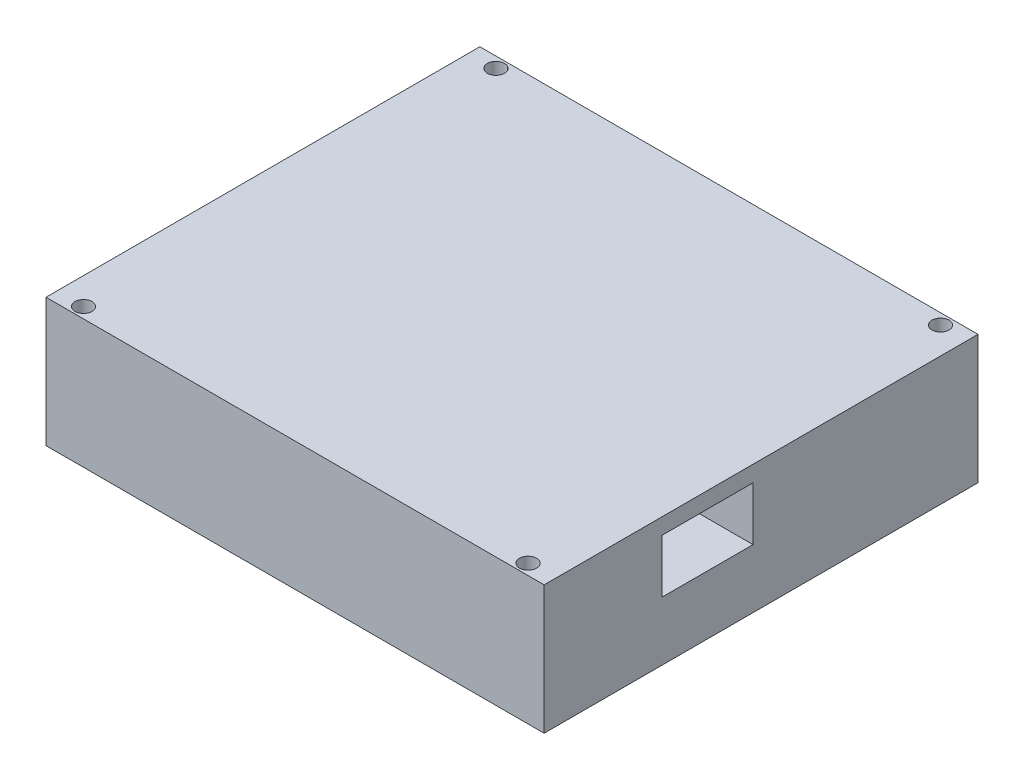
ISO-10303-21;
HEADER;
FILE_DESCRIPTION(('STEP AP214'),'2;1');
FILE_NAME('part.step','',(''),(''),'','','');
FILE_SCHEMA(('AUTOMOTIVE_DESIGN { 1 0 10303 214 1 1 1 1 }'));
ENDSEC;
DATA;
#1=APPLICATION_CONTEXT('core data for automotive mechanical design processes');
#2=APPLICATION_PROTOCOL_DEFINITION('international standard','automotive_design',2000,#1);
#3=PRODUCT_CONTEXT('',#1,'mechanical');
#4=PRODUCT('Part','Part','',(#3));
#5=PRODUCT_RELATED_PRODUCT_CATEGORY('part','',(#4));
#6=PRODUCT_DEFINITION_FORMATION('','',#4);
#7=PRODUCT_DEFINITION_CONTEXT('part definition',#1,'design');
#8=PRODUCT_DEFINITION('design','',#6,#7);
#9=PRODUCT_DEFINITION_SHAPE('','',#8);
#10=(LENGTH_UNIT() NAMED_UNIT(*) SI_UNIT(.MILLI.,.METRE.));
#11=(NAMED_UNIT(*) PLANE_ANGLE_UNIT() SI_UNIT($,.RADIAN.));
#12=(NAMED_UNIT(*) SI_UNIT($,.STERADIAN.) SOLID_ANGLE_UNIT());
#13=UNCERTAINTY_MEASURE_WITH_UNIT(LENGTH_MEASURE(1.E-05),#10,'distance_accuracy_value','');
#14=(GEOMETRIC_REPRESENTATION_CONTEXT(3) GLOBAL_UNCERTAINTY_ASSIGNED_CONTEXT((#13)) GLOBAL_UNIT_ASSIGNED_CONTEXT((#10,
#11,#12)) REPRESENTATION_CONTEXT('',''));
#15=CARTESIAN_POINT('',(0.,0.,0.));
#16=DIRECTION('',(0.,0.,1.));
#17=DIRECTION('',(1.,0.,0.));
#18=AXIS2_PLACEMENT_3D('',#15,#16,#17);
#19=CARTESIAN_POINT('',(46.5,24.,-40.5));
#20=DIRECTION('',(-1.,0.,0.));
#21=DIRECTION('',(0.,0.,1.));
#22=AXIS2_PLACEMENT_3D('',#19,#20,#21);
#23=PLANE('',#22);
#24=DIRECTION('',(0.,0.,1.));
#25=VECTOR('',#24,1.);
#26=CARTESIAN_POINT('',(46.5,21.,18.5));
#27=LINE('',#26,#25);
#28=CARTESIAN_POINT('',(46.5,21.,1.5));
#29=VERTEX_POINT('',#28);
#30=CARTESIAN_POINT('',(46.5,21.,18.5));
#31=VERTEX_POINT('',#30);
#32=EDGE_CURVE('E148',#29,#31,#27,.T.);
#33=ORIENTED_EDGE('',*,*,#32,.F.);
#34=DIRECTION('',(0.,1.,0.));
#35=VECTOR('',#34,1.);
#36=CARTESIAN_POINT('',(46.5,21.,1.5));
#37=LINE('',#36,#35);
#38=CARTESIAN_POINT('',(46.5,11.,1.5));
#39=VERTEX_POINT('',#38);
#40=EDGE_CURVE('E53',#39,#29,#37,.T.);
#41=ORIENTED_EDGE('',*,*,#40,.F.);
#42=DIRECTION('',(0.,0.,-1.));
#43=VECTOR('',#42,1.);
#44=CARTESIAN_POINT('',(46.5,11.,18.5));
#45=LINE('',#44,#43);
#46=CARTESIAN_POINT('',(46.5,11.,18.5));
#47=VERTEX_POINT('',#46);
#48=EDGE_CURVE('E135',#47,#39,#45,.T.);
#49=ORIENTED_EDGE('',*,*,#48,.F.);
#50=DIRECTION('',(0.,-1.,0.));
#51=VECTOR('',#50,1.);
#52=CARTESIAN_POINT('',(46.5,21.,18.5));
#53=LINE('',#52,#51);
#54=EDGE_CURVE('E139',#31,#47,#53,.T.);
#55=ORIENTED_EDGE('',*,*,#54,.F.);
#56=EDGE_LOOP('',(#33,#41,#49,#55));
#57=FACE_BOUND('',#56,.T.);
#58=DIRECTION('',(0.,0.,-1.));
#59=VECTOR('',#58,1.);
#60=CARTESIAN_POINT('',(46.5,0.,-40.5));
#61=LINE('',#60,#59);
#62=CARTESIAN_POINT('',(46.5,0.,40.5));
#63=VERTEX_POINT('',#62);
#64=CARTESIAN_POINT('',(46.5,0.,-40.5));
#65=VERTEX_POINT('',#64);
#66=EDGE_CURVE('E191',#63,#65,#61,.T.);
#67=ORIENTED_EDGE('',*,*,#66,.T.);
#68=DIRECTION('',(0.,-1.,0.));
#69=VECTOR('',#68,1.);
#70=CARTESIAN_POINT('',(46.5,24.,-40.5));
#71=LINE('',#70,#69);
#72=CARTESIAN_POINT('',(46.5,24.,-40.5));
#73=VERTEX_POINT('',#72);
#74=EDGE_CURVE('E11',#73,#65,#71,.T.);
#75=ORIENTED_EDGE('',*,*,#74,.F.);
#76=DIRECTION('',(0.,0.,-1.));
#77=VECTOR('',#76,1.);
#78=CARTESIAN_POINT('',(46.5,24.,-40.5));
#79=LINE('',#78,#77);
#80=CARTESIAN_POINT('',(46.5,24.,40.5));
#81=VERTEX_POINT('',#80);
#82=EDGE_CURVE('E195',#81,#73,#79,.T.);
#83=ORIENTED_EDGE('',*,*,#82,.F.);
#84=DIRECTION('',(0.,-1.,0.));
#85=VECTOR('',#84,1.);
#86=CARTESIAN_POINT('',(46.5,24.,40.5));
#87=LINE('',#86,#85);
#88=EDGE_CURVE('E205',#81,#63,#87,.T.);
#89=ORIENTED_EDGE('',*,*,#88,.T.);
#90=EDGE_LOOP('',(#67,#75,#83,#89));
#91=FACE_BOUND('',#90,.T.);
#92=ADVANCED_FACE('F38',(#57,#91),#23,.F.);
#93=CARTESIAN_POINT('',(-46.5,24.,-40.5));
#94=DIRECTION('',(0.,0.,1.));
#95=DIRECTION('',(1.,0.,0.));
#96=AXIS2_PLACEMENT_3D('',#93,#94,#95);
#97=PLANE('',#96);
#98=DIRECTION('',(-1.,0.,0.));
#99=VECTOR('',#98,1.);
#100=CARTESIAN_POINT('',(-46.5,0.,-40.5));
#101=LINE('',#100,#99);
#102=CARTESIAN_POINT('',(-46.5,0.,-40.5));
#103=VERTEX_POINT('',#102);
#104=EDGE_CURVE('E209',#65,#103,#101,.T.);
#105=ORIENTED_EDGE('',*,*,#104,.T.);
#106=DIRECTION('',(0.,-1.,0.));
#107=VECTOR('',#106,1.);
#108=CARTESIAN_POINT('',(-46.5,24.,-40.5));
#109=LINE('',#108,#107);
#110=CARTESIAN_POINT('',(-46.5,24.,-40.5));
#111=VERTEX_POINT('',#110);
#112=EDGE_CURVE('E46',#111,#103,#109,.T.);
#113=ORIENTED_EDGE('',*,*,#112,.F.);
#114=DIRECTION('',(-1.,0.,0.));
#115=VECTOR('',#114,1.);
#116=CARTESIAN_POINT('',(-46.5,24.,-40.5));
#117=LINE('',#116,#115);
#118=EDGE_CURVE('E90',#73,#111,#117,.T.);
#119=ORIENTED_EDGE('',*,*,#118,.F.);
#120=ORIENTED_EDGE('',*,*,#74,.T.);
#121=EDGE_LOOP('',(#105,#113,#119,#120));
#122=FACE_BOUND('',#121,.T.);
#123=ADVANCED_FACE('F244',(#122),#97,.F.);
#124=CARTESIAN_POINT('',(-46.5,24.,-40.5));
#125=DIRECTION('',(1.,0.,0.));
#126=DIRECTION('',(0.,0.,-1.));
#127=AXIS2_PLACEMENT_3D('',#124,#125,#126);
#128=PLANE('',#127);
#129=DIRECTION('',(0.,0.,1.));
#130=VECTOR('',#129,1.);
#131=CARTESIAN_POINT('',(-46.5,0.,-40.5));
#132=LINE('',#131,#130);
#133=CARTESIAN_POINT('',(-46.5,0.,40.5));
#134=VERTEX_POINT('',#133);
#135=EDGE_CURVE('E212',#103,#134,#132,.T.);
#136=ORIENTED_EDGE('',*,*,#135,.T.);
#137=DIRECTION('',(0.,-1.,0.));
#138=VECTOR('',#137,1.);
#139=CARTESIAN_POINT('',(-46.5,24.,40.5));
#140=LINE('',#139,#138);
#141=CARTESIAN_POINT('',(-46.5,24.,40.5));
#142=VERTEX_POINT('',#141);
#143=EDGE_CURVE('E219',#142,#134,#140,.T.);
#144=ORIENTED_EDGE('',*,*,#143,.F.);
#145=DIRECTION('',(0.,0.,1.));
#146=VECTOR('',#145,1.);
#147=CARTESIAN_POINT('',(-46.5,24.,-40.5));
#148=LINE('',#147,#146);
#149=EDGE_CURVE('E200',#111,#142,#148,.T.);
#150=ORIENTED_EDGE('',*,*,#149,.F.);
#151=ORIENTED_EDGE('',*,*,#112,.T.);
#152=EDGE_LOOP('',(#136,#144,#150,#151));
#153=FACE_BOUND('',#152,.T.);
#154=ADVANCED_FACE('F226',(#153),#128,.F.);
#155=CARTESIAN_POINT('',(-46.5,24.,40.5));
#156=DIRECTION('',(0.,0.,-1.));
#157=DIRECTION('',(-1.,0.,0.));
#158=AXIS2_PLACEMENT_3D('',#155,#156,#157);
#159=PLANE('',#158);
#160=DIRECTION('',(1.,0.,0.));
#161=VECTOR('',#160,1.);
#162=CARTESIAN_POINT('',(-46.5,0.,40.5));
#163=LINE('',#162,#161);
#164=EDGE_CURVE('E83',#134,#63,#163,.T.);
#165=ORIENTED_EDGE('',*,*,#164,.T.);
#166=ORIENTED_EDGE('',*,*,#88,.F.);
#167=DIRECTION('',(1.,0.,0.));
#168=VECTOR('',#167,1.);
#169=CARTESIAN_POINT('',(-46.5,24.,40.5));
#170=LINE('',#169,#168);
#171=EDGE_CURVE('E62',#142,#81,#170,.T.);
#172=ORIENTED_EDGE('',*,*,#171,.F.);
#173=ORIENTED_EDGE('',*,*,#143,.T.);
#174=EDGE_LOOP('',(#165,#166,#172,#173));
#175=FACE_BOUND('',#174,.T.);
#176=ADVANCED_FACE('F234',(#175),#159,.F.);
#177=CARTESIAN_POINT('',(0.,24.,0.));
#178=DIRECTION('',(0.,1.,0.));
#179=DIRECTION('',(0.,0.,1.));
#180=AXIS2_PLACEMENT_3D('',#177,#178,#179);
#181=PLANE('',#180);
#182=CARTESIAN_POINT('',(41.5,24.,-38.5));
#183=DIRECTION('',(0.,1.,0.));
#184=DIRECTION('',(0.,0.,-1.));
#185=AXIS2_PLACEMENT_3D('',#182,#183,#184);
#186=CIRCLE('',#185,1.6);
#187=CARTESIAN_POINT('',(41.5,24.,-40.1));
#188=VERTEX_POINT('',#187);
#189=EDGE_CURVE('E157',#188,#188,#186,.T.);
#190=ORIENTED_EDGE('',*,*,#189,.F.);
#191=EDGE_LOOP('',(#190));
#192=FACE_BOUND('',#191,.T.);
#193=CARTESIAN_POINT('',(41.5,24.,38.5));
#194=DIRECTION('',(0.,1.,0.));
#195=DIRECTION('',(0.,0.,1.));
#196=AXIS2_PLACEMENT_3D('',#193,#194,#195);
#197=CIRCLE('',#196,1.6);
#198=CARTESIAN_POINT('',(41.5,24.,40.1));
#199=VERTEX_POINT('',#198);
#200=EDGE_CURVE('E176',#199,#199,#197,.T.);
#201=ORIENTED_EDGE('',*,*,#200,.F.);
#202=EDGE_LOOP('',(#201));
#203=FACE_BOUND('',#202,.T.);
#204=CARTESIAN_POINT('',(-41.5,24.,38.5));
#205=DIRECTION('',(0.,1.,0.));
#206=DIRECTION('',(0.,0.,-1.));
#207=AXIS2_PLACEMENT_3D('',#204,#205,#206);
#208=CIRCLE('',#207,1.6);
#209=CARTESIAN_POINT('',(-41.5,24.,36.9));
#210=VERTEX_POINT('',#209);
#211=EDGE_CURVE('E168',#210,#210,#208,.T.);
#212=ORIENTED_EDGE('',*,*,#211,.F.);
#213=EDGE_LOOP('',(#212));
#214=FACE_BOUND('',#213,.T.);
#215=CARTESIAN_POINT('',(-41.5,24.,-38.5));
#216=DIRECTION('',(0.,1.,0.));
#217=DIRECTION('',(0.,0.,1.));
#218=AXIS2_PLACEMENT_3D('',#215,#216,#217);
#219=CIRCLE('',#218,1.6);
#220=CARTESIAN_POINT('',(-41.5,24.,-36.9));
#221=VERTEX_POINT('',#220);
#222=EDGE_CURVE('E167',#221,#221,#219,.T.);
#223=ORIENTED_EDGE('',*,*,#222,.F.);
#224=EDGE_LOOP('',(#223));
#225=FACE_BOUND('',#224,.T.);
#226=ORIENTED_EDGE('',*,*,#82,.T.);
#227=ORIENTED_EDGE('',*,*,#118,.T.);
#228=ORIENTED_EDGE('',*,*,#149,.T.);
#229=ORIENTED_EDGE('',*,*,#171,.T.);
#230=EDGE_LOOP('',(#226,#227,#228,#229));
#231=FACE_BOUND('',#230,.T.);
#232=ADVANCED_FACE('F236',(#192,#203,#214,#225,#231),#181,.T.);
#233=CARTESIAN_POINT('',(0.,0.,0.));
#234=DIRECTION('',(0.,1.,0.));
#235=DIRECTION('',(0.,0.,1.));
#236=AXIS2_PLACEMENT_3D('',#233,#234,#235);
#237=PLANE('',#236);
#238=CARTESIAN_POINT('',(41.5,0.,-38.5));
#239=DIRECTION('',(0.,1.,0.));
#240=DIRECTION('',(0.,0.,-1.));
#241=AXIS2_PLACEMENT_3D('',#238,#239,#240);
#242=CIRCLE('',#241,1.6);
#243=CARTESIAN_POINT('',(41.5,0.,-40.1));
#244=VERTEX_POINT('',#243);
#245=EDGE_CURVE('E180',#244,#244,#242,.T.);
#246=ORIENTED_EDGE('',*,*,#245,.T.);
#247=EDGE_LOOP('',(#246));
#248=FACE_BOUND('',#247,.T.);
#249=CARTESIAN_POINT('',(41.5,0.,38.5));
#250=DIRECTION('',(0.,1.,0.));
#251=DIRECTION('',(0.,0.,1.));
#252=AXIS2_PLACEMENT_3D('',#249,#250,#251);
#253=CIRCLE('',#252,1.6);
#254=CARTESIAN_POINT('',(41.5,0.,40.1));
#255=VERTEX_POINT('',#254);
#256=EDGE_CURVE('E172',#255,#255,#253,.T.);
#257=ORIENTED_EDGE('',*,*,#256,.T.);
#258=EDGE_LOOP('',(#257));
#259=FACE_BOUND('',#258,.T.);
#260=CARTESIAN_POINT('',(-41.5,0.,38.5));
#261=DIRECTION('',(0.,1.,0.));
#262=DIRECTION('',(0.,0.,-1.));
#263=AXIS2_PLACEMENT_3D('',#260,#261,#262);
#264=CIRCLE('',#263,1.6);
#265=CARTESIAN_POINT('',(-41.5,0.,36.9));
#266=VERTEX_POINT('',#265);
#267=EDGE_CURVE('E163',#266,#266,#264,.T.);
#268=ORIENTED_EDGE('',*,*,#267,.T.);
#269=EDGE_LOOP('',(#268));
#270=FACE_BOUND('',#269,.T.);
#271=CARTESIAN_POINT('',(-41.5,0.,-38.5));
#272=DIRECTION('',(0.,1.,0.));
#273=DIRECTION('',(0.,0.,1.));
#274=AXIS2_PLACEMENT_3D('',#271,#272,#273);
#275=CIRCLE('',#274,1.6);
#276=CARTESIAN_POINT('',(-41.5,0.,-36.9));
#277=VERTEX_POINT('',#276);
#278=EDGE_CURVE('E187',#277,#277,#275,.T.);
#279=ORIENTED_EDGE('',*,*,#278,.T.);
#280=EDGE_LOOP('',(#279));
#281=FACE_BOUND('',#280,.T.);
#282=ORIENTED_EDGE('',*,*,#66,.F.);
#283=ORIENTED_EDGE('',*,*,#164,.F.);
#284=ORIENTED_EDGE('',*,*,#135,.F.);
#285=ORIENTED_EDGE('',*,*,#104,.F.);
#286=EDGE_LOOP('',(#282,#283,#284,#285));
#287=FACE_BOUND('',#286,.T.);
#288=ADVANCED_FACE('F230',(#248,#259,#270,#281,#287),#237,.F.);
#289=CARTESIAN_POINT('',(-41.5,0.,-38.5));
#290=DIRECTION('',(0.,1.,0.));
#291=DIRECTION('',(0.,0.,1.));
#292=AXIS2_PLACEMENT_3D('',#289,#290,#291);
#293=CYLINDRICAL_SURFACE('',#292,1.6);
#294=ORIENTED_EDGE('',*,*,#278,.F.);
#295=EDGE_LOOP('',(#294));
#296=FACE_BOUND('',#295,.T.);
#297=ORIENTED_EDGE('',*,*,#222,.T.);
#298=EDGE_LOOP('',(#297));
#299=FACE_BOUND('',#298,.T.);
#300=ADVANCED_FACE('F277',(#296,#299),#293,.F.);
#301=CARTESIAN_POINT('',(-41.5,0.,38.5));
#302=DIRECTION('',(0.,1.,0.));
#303=DIRECTION('',(0.,0.,1.));
#304=AXIS2_PLACEMENT_3D('',#301,#302,#303);
#305=CYLINDRICAL_SURFACE('',#304,1.6);
#306=ORIENTED_EDGE('',*,*,#267,.F.);
#307=EDGE_LOOP('',(#306));
#308=FACE_BOUND('',#307,.T.);
#309=ORIENTED_EDGE('',*,*,#211,.T.);
#310=EDGE_LOOP('',(#309));
#311=FACE_BOUND('',#310,.T.);
#312=ADVANCED_FACE('F273',(#308,#311),#305,.F.);
#313=CARTESIAN_POINT('',(41.5,0.,38.5));
#314=DIRECTION('',(0.,1.,0.));
#315=DIRECTION('',(0.,0.,1.));
#316=AXIS2_PLACEMENT_3D('',#313,#314,#315);
#317=CYLINDRICAL_SURFACE('',#316,1.6);
#318=ORIENTED_EDGE('',*,*,#256,.F.);
#319=EDGE_LOOP('',(#318));
#320=FACE_BOUND('',#319,.T.);
#321=ORIENTED_EDGE('',*,*,#200,.T.);
#322=EDGE_LOOP('',(#321));
#323=FACE_BOUND('',#322,.T.);
#324=ADVANCED_FACE('F276',(#320,#323),#317,.F.);
#325=CARTESIAN_POINT('',(41.5,0.,-38.5));
#326=DIRECTION('',(0.,1.,0.));
#327=DIRECTION('',(0.,0.,1.));
#328=AXIS2_PLACEMENT_3D('',#325,#326,#327);
#329=CYLINDRICAL_SURFACE('',#328,1.6);
#330=ORIENTED_EDGE('',*,*,#245,.F.);
#331=EDGE_LOOP('',(#330));
#332=FACE_BOUND('',#331,.T.);
#333=ORIENTED_EDGE('',*,*,#189,.T.);
#334=EDGE_LOOP('',(#333));
#335=FACE_BOUND('',#334,.T.);
#336=ADVANCED_FACE('F267',(#332,#335),#329,.F.);
#337=CARTESIAN_POINT('',(26.5,21.,1.5));
#338=DIRECTION('',(0.,0.,-1.));
#339=DIRECTION('',(-1.,0.,0.));
#340=AXIS2_PLACEMENT_3D('',#337,#338,#339);
#341=PLANE('',#340);
#342=ORIENTED_EDGE('',*,*,#40,.T.);
#343=DIRECTION('',(1.,0.,0.));
#344=VECTOR('',#343,1.);
#345=CARTESIAN_POINT('',(26.5,21.,1.5));
#346=LINE('',#345,#344);
#347=CARTESIAN_POINT('',(26.5,21.,1.5));
#348=VERTEX_POINT('',#347);
#349=EDGE_CURVE('E110',#348,#29,#346,.T.);
#350=ORIENTED_EDGE('',*,*,#349,.F.);
#351=DIRECTION('',(0.,1.,0.));
#352=VECTOR('',#351,1.);
#353=CARTESIAN_POINT('',(26.5,21.,1.5));
#354=LINE('',#353,#352);
#355=CARTESIAN_POINT('',(26.5,11.,1.5));
#356=VERTEX_POINT('',#355);
#357=EDGE_CURVE('E114',#356,#348,#354,.T.);
#358=ORIENTED_EDGE('',*,*,#357,.F.);
#359=DIRECTION('',(1.,0.,0.));
#360=VECTOR('',#359,1.);
#361=CARTESIAN_POINT('',(26.5,11.,1.5));
#362=LINE('',#361,#360);
#363=EDGE_CURVE('E154',#356,#39,#362,.T.);
#364=ORIENTED_EDGE('',*,*,#363,.T.);
#365=EDGE_LOOP('',(#342,#350,#358,#364));
#366=FACE_BOUND('',#365,.T.);
#367=ADVANCED_FACE('F112',(#366),#341,.F.);
#368=CARTESIAN_POINT('',(26.5,11.,18.5));
#369=DIRECTION('',(0.,-1.,0.));
#370=DIRECTION('',(0.,0.,-1.));
#371=AXIS2_PLACEMENT_3D('',#368,#369,#370);
#372=PLANE('',#371);
#373=ORIENTED_EDGE('',*,*,#48,.T.);
#374=ORIENTED_EDGE('',*,*,#363,.F.);
#375=DIRECTION('',(0.,0.,-1.));
#376=VECTOR('',#375,1.);
#377=CARTESIAN_POINT('',(26.5,11.,18.5));
#378=LINE('',#377,#376);
#379=CARTESIAN_POINT('',(26.5,11.,18.5));
#380=VERTEX_POINT('',#379);
#381=EDGE_CURVE('E121',#380,#356,#378,.T.);
#382=ORIENTED_EDGE('',*,*,#381,.F.);
#383=DIRECTION('',(1.,0.,0.));
#384=VECTOR('',#383,1.);
#385=CARTESIAN_POINT('',(26.5,11.,18.5));
#386=LINE('',#385,#384);
#387=EDGE_CURVE('E158',#380,#47,#386,.T.);
#388=ORIENTED_EDGE('',*,*,#387,.T.);
#389=EDGE_LOOP('',(#373,#374,#382,#388));
#390=FACE_BOUND('',#389,.T.);
#391=ADVANCED_FACE('F259',(#390),#372,.F.);
#392=CARTESIAN_POINT('',(26.5,21.,18.5));
#393=DIRECTION('',(0.,0.,1.));
#394=DIRECTION('',(1.,0.,0.));
#395=AXIS2_PLACEMENT_3D('',#392,#393,#394);
#396=PLANE('',#395);
#397=ORIENTED_EDGE('',*,*,#54,.T.);
#398=ORIENTED_EDGE('',*,*,#387,.F.);
#399=DIRECTION('',(0.,-1.,0.));
#400=VECTOR('',#399,1.);
#401=CARTESIAN_POINT('',(26.5,21.,18.5));
#402=LINE('',#401,#400);
#403=CARTESIAN_POINT('',(26.5,21.,18.5));
#404=VERTEX_POINT('',#403);
#405=EDGE_CURVE('E130',#404,#380,#402,.T.);
#406=ORIENTED_EDGE('',*,*,#405,.F.);
#407=DIRECTION('',(1.,0.,0.));
#408=VECTOR('',#407,1.);
#409=CARTESIAN_POINT('',(26.5,21.,18.5));
#410=LINE('',#409,#408);
#411=EDGE_CURVE('E120',#404,#31,#410,.T.);
#412=ORIENTED_EDGE('',*,*,#411,.T.);
#413=EDGE_LOOP('',(#397,#398,#406,#412));
#414=FACE_BOUND('',#413,.T.);
#415=ADVANCED_FACE('F257',(#414),#396,.F.);
#416=CARTESIAN_POINT('',(26.5,21.,18.5));
#417=DIRECTION('',(0.,1.,0.));
#418=DIRECTION('',(0.,0.,1.));
#419=AXIS2_PLACEMENT_3D('',#416,#417,#418);
#420=PLANE('',#419);
#421=ORIENTED_EDGE('',*,*,#32,.T.);
#422=ORIENTED_EDGE('',*,*,#411,.F.);
#423=DIRECTION('',(0.,0.,1.));
#424=VECTOR('',#423,1.);
#425=CARTESIAN_POINT('',(26.5,21.,18.5));
#426=LINE('',#425,#424);
#427=EDGE_CURVE('E124',#348,#404,#426,.T.);
#428=ORIENTED_EDGE('',*,*,#427,.F.);
#429=ORIENTED_EDGE('',*,*,#349,.T.);
#430=EDGE_LOOP('',(#421,#422,#428,#429));
#431=FACE_BOUND('',#430,.T.);
#432=ADVANCED_FACE('F125',(#431),#420,.F.);
#433=CARTESIAN_POINT('',(26.5,0.,0.));
#434=DIRECTION('',(1.,0.,0.));
#435=DIRECTION('',(0.,0.,-1.));
#436=AXIS2_PLACEMENT_3D('',#433,#434,#435);
#437=PLANE('',#436);
#438=ORIENTED_EDGE('',*,*,#357,.T.);
#439=ORIENTED_EDGE('',*,*,#427,.T.);
#440=ORIENTED_EDGE('',*,*,#405,.T.);
#441=ORIENTED_EDGE('',*,*,#381,.T.);
#442=EDGE_LOOP('',(#438,#439,#440,#441));
#443=FACE_BOUND('',#442,.T.);
#444=ADVANCED_FACE('F132',(#443),#437,.T.);
#445=CLOSED_SHELL('',(#92,#123,#154,#176,#232,#288,#300,#312,#324,#336,#367,#391,#415,#432,#444));
#446=MANIFOLD_SOLID_BREP('B2',#445);
#447=ADVANCED_BREP_SHAPE_REPRESENTATION('',(#18,#446),#14);
#448=SHAPE_DEFINITION_REPRESENTATION(#9,#447);
ENDSEC;
END-ISO-10303-21;
